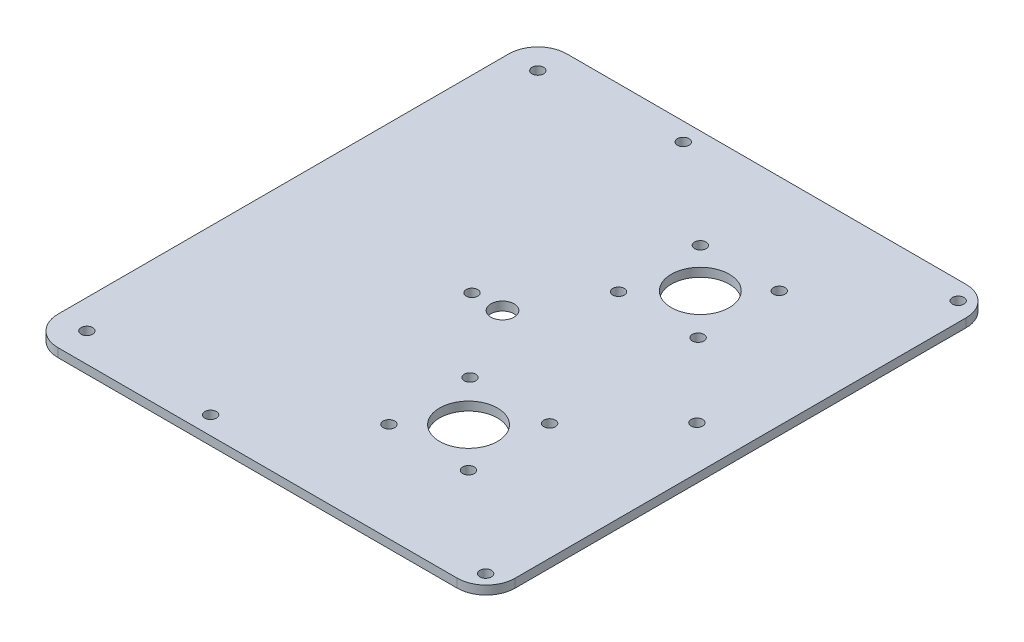
ISO-10303-21;
HEADER;
FILE_DESCRIPTION(('STEP AP214'),'2;1');
FILE_NAME('part.step','',(''),(''),'','','');
FILE_SCHEMA(('AUTOMOTIVE_DESIGN { 1 0 10303 214 1 1 1 1 }'));
ENDSEC;
DATA;
#1=APPLICATION_CONTEXT('core data for automotive mechanical design processes');
#2=APPLICATION_PROTOCOL_DEFINITION('international standard','automotive_design',2000,#1);
#3=PRODUCT_CONTEXT('',#1,'mechanical');
#4=PRODUCT('Part','Part','',(#3));
#5=PRODUCT_RELATED_PRODUCT_CATEGORY('part','',(#4));
#6=PRODUCT_DEFINITION_FORMATION('','',#4);
#7=PRODUCT_DEFINITION_CONTEXT('part definition',#1,'design');
#8=PRODUCT_DEFINITION('design','',#6,#7);
#9=PRODUCT_DEFINITION_SHAPE('','',#8);
#10=(LENGTH_UNIT() NAMED_UNIT(*) SI_UNIT(.MILLI.,.METRE.));
#11=(NAMED_UNIT(*) PLANE_ANGLE_UNIT() SI_UNIT($,.RADIAN.));
#12=(NAMED_UNIT(*) SI_UNIT($,.STERADIAN.) SOLID_ANGLE_UNIT());
#13=UNCERTAINTY_MEASURE_WITH_UNIT(LENGTH_MEASURE(1.E-05),#10,'distance_accuracy_value','');
#14=(GEOMETRIC_REPRESENTATION_CONTEXT(3) GLOBAL_UNCERTAINTY_ASSIGNED_CONTEXT((#13)) GLOBAL_UNIT_ASSIGNED_CONTEXT((#10,
#11,#12)) REPRESENTATION_CONTEXT('',''));
#15=CARTESIAN_POINT('',(0.,0.,0.));
#16=DIRECTION('',(0.,0.,1.));
#17=DIRECTION('',(1.,0.,0.));
#18=AXIS2_PLACEMENT_3D('',#15,#16,#17);
#19=CARTESIAN_POINT('',(-68.915,3.,77.83));
#20=DIRECTION('',(0.,1.,0.));
#21=DIRECTION('',(0.,0.,1.));
#22=AXIS2_PLACEMENT_3D('',#19,#20,#21);
#23=PLANE('',#22);
#24=CARTESIAN_POINT('',(38.6101586084337,3.,53.6336921319907));
#25=DIRECTION('',(0.,1.,0.));
#26=DIRECTION('',(0.,0.,1.));
#27=AXIS2_PLACEMENT_3D('',#24,#25,#26);
#28=CIRCLE('',#27,2.);
#29=CARTESIAN_POINT('',(38.6101586084337,3.,55.6336921319907));
#30=VERTEX_POINT('',#29);
#31=EDGE_CURVE('E280',#30,#30,#28,.T.);
#32=ORIENTED_EDGE('',*,*,#31,.F.);
#33=EDGE_LOOP('',(#32));
#34=FACE_BOUND('',#33,.T.);
#35=CARTESIAN_POINT('',(25.,3.,40.));
#36=DIRECTION('',(0.,1.,0.));
#37=DIRECTION('',(0.,0.,-1.));
#38=AXIS2_PLACEMENT_3D('',#35,#36,#37);
#39=CIRCLE('',#38,9.99999999999999);
#40=CARTESIAN_POINT('',(25.,3.,30.));
#41=VERTEX_POINT('',#40);
#42=EDGE_CURVE('E268',#41,#41,#39,.T.);
#43=ORIENTED_EDGE('',*,*,#42,.F.);
#44=EDGE_LOOP('',(#43));
#45=FACE_BOUND('',#44,.T.);
#46=CARTESIAN_POINT('',(11.1442287877805,3.,-25.6336921319907));
#47=DIRECTION('',(0.,1.,0.));
#48=DIRECTION('',(0.,0.,-1.));
#49=AXIS2_PLACEMENT_3D('',#46,#47,#48);
#50=CIRCLE('',#49,2.);
#51=CARTESIAN_POINT('',(11.1442287877805,3.,-27.6336921319907));
#52=VERTEX_POINT('',#51);
#53=EDGE_CURVE('E256',#52,#52,#50,.T.);
#54=ORIENTED_EDGE('',*,*,#53,.F.);
#55=EDGE_LOOP('',(#54));
#56=FACE_BOUND('',#55,.T.);
#57=CARTESIAN_POINT('',(38.6101586084337,3.,-53.6336921319907));
#58=DIRECTION('',(0.,1.,0.));
#59=DIRECTION('',(0.,0.,-1.));
#60=AXIS2_PLACEMENT_3D('',#57,#58,#59);
#61=CIRCLE('',#60,2.);
#62=CARTESIAN_POINT('',(38.6101586084337,3.,-55.6336921319907));
#63=VERTEX_POINT('',#62);
#64=EDGE_CURVE('E244',#63,#63,#61,.T.);
#65=ORIENTED_EDGE('',*,*,#64,.F.);
#66=EDGE_LOOP('',(#65));
#67=FACE_BOUND('',#66,.T.);
#68=CARTESIAN_POINT('',(-13.8262995500435,3.,2.22044604925031E-13));
#69=DIRECTION('',(0.,1.,0.));
#70=DIRECTION('',(0.,0.,-1.));
#71=AXIS2_PLACEMENT_3D('',#68,#69,#70);
#72=CIRCLE('',#71,2.00000000000001);
#73=CARTESIAN_POINT('',(-13.8262995500435,3.,-1.99999999999979));
#74=VERTEX_POINT('',#73);
#75=EDGE_CURVE('E232',#74,#74,#72,.T.);
#76=ORIENTED_EDGE('',*,*,#75,.F.);
#77=EDGE_LOOP('',(#76));
#78=FACE_BOUND('',#77,.T.);
#79=CARTESIAN_POINT('',(-22.4650000000001,3.,-81.5699999999996));
#80=DIRECTION('',(0.,1.,0.));
#81=DIRECTION('',(0.,0.,-1.));
#82=AXIS2_PLACEMENT_3D('',#79,#80,#81);
#83=CIRCLE('',#82,2.00000000000001);
#84=CARTESIAN_POINT('',(-22.4650000000001,3.,-83.5699999999996));
#85=VERTEX_POINT('',#84);
#86=EDGE_CURVE('E220',#85,#85,#83,.T.);
#87=ORIENTED_EDGE('',*,*,#86,.F.);
#88=EDGE_LOOP('',(#87));
#89=FACE_BOUND('',#88,.T.);
#90=CARTESIAN_POINT('',(72.465,3.,81.57));
#91=DIRECTION('',(0.,1.,0.));
#92=DIRECTION('',(0.,0.,-1.));
#93=AXIS2_PLACEMENT_3D('',#90,#91,#92);
#94=CIRCLE('',#93,2.);
#95=CARTESIAN_POINT('',(72.465,3.,79.57));
#96=VERTEX_POINT('',#95);
#97=EDGE_CURVE('E208',#96,#96,#94,.T.);
#98=ORIENTED_EDGE('',*,*,#97,.F.);
#99=EDGE_LOOP('',(#98));
#100=FACE_BOUND('',#99,.T.);
#101=CARTESIAN_POINT('',(72.465,3.,-81.57));
#102=DIRECTION('',(0.,1.,0.));
#103=DIRECTION('',(0.,0.,1.));
#104=AXIS2_PLACEMENT_3D('',#101,#102,#103);
#105=CIRCLE('',#104,2.);
#106=CARTESIAN_POINT('',(72.465,3.,-79.57));
#107=VERTEX_POINT('',#106);
#108=EDGE_CURVE('E196',#107,#107,#105,.T.);
#109=ORIENTED_EDGE('',*,*,#108,.F.);
#110=EDGE_LOOP('',(#109));
#111=FACE_BOUND('',#110,.T.);
#112=CARTESIAN_POINT('',(25.,3.,-40.));
#113=DIRECTION('',(0.,1.,0.));
#114=DIRECTION('',(0.,0.,1.));
#115=AXIS2_PLACEMENT_3D('',#112,#113,#114);
#116=CIRCLE('',#115,10.);
#117=CARTESIAN_POINT('',(25.,3.,-30.));
#118=VERTEX_POINT('',#117);
#119=EDGE_CURVE('E184',#118,#118,#116,.T.);
#120=ORIENTED_EDGE('',*,*,#119,.F.);
#121=EDGE_LOOP('',(#120));
#122=FACE_BOUND('',#121,.T.);
#123=CARTESIAN_POINT('',(-68.915,3.,77.83));
#124=DIRECTION('',(0.,1.,0.));
#125=DIRECTION('',(0.,0.,1.));
#126=AXIS2_PLACEMENT_3D('',#123,#124,#125);
#127=CIRCLE('',#126,9.99999999999999);
#128=CARTESIAN_POINT('',(-78.915,3.,77.83));
#129=VERTEX_POINT('',#128);
#130=CARTESIAN_POINT('',(-68.915,3.,87.83));
#131=VERTEX_POINT('',#130);
#132=EDGE_CURVE('E147',#129,#131,#127,.T.);
#133=ORIENTED_EDGE('',*,*,#132,.T.);
#134=DIRECTION('',(1.,0.,0.));
#135=VECTOR('',#134,1.);
#136=CARTESIAN_POINT('',(-68.915,3.,87.83));
#137=LINE('',#136,#135);
#138=CARTESIAN_POINT('',(68.9150000000001,3.,87.83));
#139=VERTEX_POINT('',#138);
#140=EDGE_CURVE('E95',#131,#139,#137,.T.);
#141=ORIENTED_EDGE('',*,*,#140,.T.);
#142=CARTESIAN_POINT('',(68.9150000000001,3.,77.83));
#143=DIRECTION('',(0.,1.,0.));
#144=DIRECTION('',(0.,0.,1.));
#145=AXIS2_PLACEMENT_3D('',#142,#143,#144);
#146=CIRCLE('',#145,9.99999999999999);
#147=CARTESIAN_POINT('',(78.915,3.,77.83));
#148=VERTEX_POINT('',#147);
#149=EDGE_CURVE('E162',#139,#148,#146,.T.);
#150=ORIENTED_EDGE('',*,*,#149,.T.);
#151=DIRECTION('',(0.,0.,-1.));
#152=VECTOR('',#151,1.);
#153=CARTESIAN_POINT('',(78.915,3.,-77.8299999999999));
#154=LINE('',#153,#152);
#155=CARTESIAN_POINT('',(78.915,3.,-77.8299999999999));
#156=VERTEX_POINT('',#155);
#157=EDGE_CURVE('E175',#148,#156,#154,.T.);
#158=ORIENTED_EDGE('',*,*,#157,.T.);
#159=CARTESIAN_POINT('',(68.915,3.,-77.83));
#160=DIRECTION('',(0.,1.,0.));
#161=DIRECTION('',(0.,0.,1.));
#162=AXIS2_PLACEMENT_3D('',#159,#160,#161);
#163=CIRCLE('',#162,10.);
#164=CARTESIAN_POINT('',(68.9149999999999,3.,-87.83));
#165=VERTEX_POINT('',#164);
#166=EDGE_CURVE('E114',#156,#165,#163,.T.);
#167=ORIENTED_EDGE('',*,*,#166,.T.);
#168=DIRECTION('',(-1.,0.,0.));
#169=VECTOR('',#168,1.);
#170=CARTESIAN_POINT('',(-68.9149999999999,3.,-87.83));
#171=LINE('',#170,#169);
#172=CARTESIAN_POINT('',(-68.9149999999999,3.,-87.83));
#173=VERTEX_POINT('',#172);
#174=EDGE_CURVE('E108',#165,#173,#171,.T.);
#175=ORIENTED_EDGE('',*,*,#174,.T.);
#176=CARTESIAN_POINT('',(-68.915,3.,-77.83));
#177=DIRECTION('',(0.,1.,0.));
#178=DIRECTION('',(0.,0.,1.));
#179=AXIS2_PLACEMENT_3D('',#176,#177,#178);
#180=CIRCLE('',#179,9.99999999999999);
#181=CARTESIAN_POINT('',(-78.915,3.,-77.8299999999999));
#182=VERTEX_POINT('',#181);
#183=EDGE_CURVE('E112',#173,#182,#180,.T.);
#184=ORIENTED_EDGE('',*,*,#183,.T.);
#185=DIRECTION('',(0.,0.,1.));
#186=VECTOR('',#185,1.);
#187=CARTESIAN_POINT('',(-78.915,3.,-77.8299999999999));
#188=LINE('',#187,#186);
#189=EDGE_CURVE('E52',#182,#129,#188,.T.);
#190=ORIENTED_EDGE('',*,*,#189,.T.);
#191=EDGE_LOOP('',(#133,#141,#150,#158,#167,#175,#184,#190));
#192=FACE_BOUND('',#191,.T.);
#193=CARTESIAN_POINT('',(11.3898413915664,3.,-53.6336921319907));
#194=DIRECTION('',(0.,1.,0.));
#195=DIRECTION('',(0.,0.,1.));
#196=AXIS2_PLACEMENT_3D('',#193,#194,#195);
#197=CIRCLE('',#196,2.00000000000001);
#198=CARTESIAN_POINT('',(11.3898413915664,3.,-51.6336921319907));
#199=VERTEX_POINT('',#198);
#200=EDGE_CURVE('E136',#199,#199,#197,.T.);
#201=ORIENTED_EDGE('',*,*,#200,.F.);
#202=EDGE_LOOP('',(#201));
#203=FACE_BOUND('',#202,.T.);
#204=CARTESIAN_POINT('',(63.826299550044,3.,0.));
#205=DIRECTION('',(0.,1.,0.));
#206=DIRECTION('',(0.,0.,1.));
#207=AXIS2_PLACEMENT_3D('',#204,#205,#206);
#208=CIRCLE('',#207,2.);
#209=CARTESIAN_POINT('',(63.826299550044,3.,2.));
#210=VERTEX_POINT('',#209);
#211=EDGE_CURVE('E190',#210,#210,#208,.T.);
#212=ORIENTED_EDGE('',*,*,#211,.F.);
#213=EDGE_LOOP('',(#212));
#214=FACE_BOUND('',#213,.T.);
#215=CARTESIAN_POINT('',(-68.915,3.,77.83));
#216=DIRECTION('',(0.,1.,0.));
#217=DIRECTION('',(0.,0.,-1.));
#218=AXIS2_PLACEMENT_3D('',#215,#216,#217);
#219=CIRCLE('',#218,1.99999999999998);
#220=CARTESIAN_POINT('',(-68.915,3.,75.83));
#221=VERTEX_POINT('',#220);
#222=EDGE_CURVE('E202',#221,#221,#219,.T.);
#223=ORIENTED_EDGE('',*,*,#222,.F.);
#224=EDGE_LOOP('',(#223));
#225=FACE_BOUND('',#224,.T.);
#226=CARTESIAN_POINT('',(-22.4649999999989,3.,81.5700000000002));
#227=DIRECTION('',(0.,1.,0.));
#228=DIRECTION('',(0.,0.,1.));
#229=AXIS2_PLACEMENT_3D('',#226,#227,#228);
#230=CIRCLE('',#229,2.00000000000006);
#231=CARTESIAN_POINT('',(-22.4649999999989,3.,83.5700000000003));
#232=VERTEX_POINT('',#231);
#233=EDGE_CURVE('E214',#232,#232,#230,.T.);
#234=ORIENTED_EDGE('',*,*,#233,.F.);
#235=EDGE_LOOP('',(#234));
#236=FACE_BOUND('',#235,.T.);
#237=CARTESIAN_POINT('',(-68.915,3.,-77.83));
#238=DIRECTION('',(0.,1.,0.));
#239=DIRECTION('',(0.,0.,1.));
#240=AXIS2_PLACEMENT_3D('',#237,#238,#239);
#241=CIRCLE('',#240,2.);
#242=CARTESIAN_POINT('',(-68.915,3.,-75.83));
#243=VERTEX_POINT('',#242);
#244=EDGE_CURVE('E226',#243,#243,#241,.T.);
#245=ORIENTED_EDGE('',*,*,#244,.F.);
#246=EDGE_LOOP('',(#245));
#247=FACE_BOUND('',#246,.T.);
#248=CARTESIAN_POINT('',(-3.29023143834206,3.,0.));
#249=DIRECTION('',(0.,1.,0.));
#250=DIRECTION('',(0.,0.,1.));
#251=AXIS2_PLACEMENT_3D('',#248,#249,#250);
#252=CIRCLE('',#251,4.);
#253=CARTESIAN_POINT('',(-3.29023143834206,3.,4.));
#254=VERTEX_POINT('',#253);
#255=EDGE_CURVE('E238',#254,#254,#252,.T.);
#256=ORIENTED_EDGE('',*,*,#255,.F.);
#257=EDGE_LOOP('',(#256));
#258=FACE_BOUND('',#257,.T.);
#259=CARTESIAN_POINT('',(38.6101586084337,3.,-25.6336921319907));
#260=DIRECTION('',(0.,1.,0.));
#261=DIRECTION('',(0.,0.,1.));
#262=AXIS2_PLACEMENT_3D('',#259,#260,#261);
#263=CIRCLE('',#262,2.);
#264=CARTESIAN_POINT('',(38.6101586084337,3.,-23.6336921319907));
#265=VERTEX_POINT('',#264);
#266=EDGE_CURVE('E250',#265,#265,#263,.T.);
#267=ORIENTED_EDGE('',*,*,#266,.F.);
#268=EDGE_LOOP('',(#267));
#269=FACE_BOUND('',#268,.T.);
#270=CARTESIAN_POINT('',(11.1442287877805,3.,25.6336921319907));
#271=DIRECTION('',(0.,1.,0.));
#272=DIRECTION('',(0.,0.,1.));
#273=AXIS2_PLACEMENT_3D('',#270,#271,#272);
#274=CIRCLE('',#273,2.);
#275=CARTESIAN_POINT('',(11.1442287877805,3.,27.6336921319907));
#276=VERTEX_POINT('',#275);
#277=EDGE_CURVE('E262',#276,#276,#274,.T.);
#278=ORIENTED_EDGE('',*,*,#277,.F.);
#279=EDGE_LOOP('',(#278));
#280=FACE_BOUND('',#279,.T.);
#281=CARTESIAN_POINT('',(38.6101586084337,3.,25.6336921319907));
#282=DIRECTION('',(0.,1.,0.));
#283=DIRECTION('',(0.,0.,-1.));
#284=AXIS2_PLACEMENT_3D('',#281,#282,#283);
#285=CIRCLE('',#284,2.);
#286=CARTESIAN_POINT('',(38.6101586084337,3.,23.6336921319907));
#287=VERTEX_POINT('',#286);
#288=EDGE_CURVE('E274',#287,#287,#285,.T.);
#289=ORIENTED_EDGE('',*,*,#288,.F.);
#290=EDGE_LOOP('',(#289));
#291=FACE_BOUND('',#290,.T.);
#292=CARTESIAN_POINT('',(11.1442287877805,3.,53.6336921319907));
#293=DIRECTION('',(0.,1.,0.));
#294=DIRECTION('',(0.,0.,-1.));
#295=AXIS2_PLACEMENT_3D('',#292,#293,#294);
#296=CIRCLE('',#295,2.);
#297=CARTESIAN_POINT('',(11.1442287877805,3.,51.6336921319907));
#298=VERTEX_POINT('',#297);
#299=EDGE_CURVE('E286',#298,#298,#296,.T.);
#300=ORIENTED_EDGE('',*,*,#299,.F.);
#301=EDGE_LOOP('',(#300));
#302=FACE_BOUND('',#301,.T.);
#303=ADVANCED_FACE('F35',(#34,#45,#56,#67,#78,#89,#100,#111,#122,#192,#203,#214,#225,#236,#247,
#258,#269,#280,#291,#302),#23,.T.);
#304=CARTESIAN_POINT('',(-68.915,0.,77.83));
#305=DIRECTION('',(0.,1.,0.));
#306=DIRECTION('',(0.,0.,1.));
#307=AXIS2_PLACEMENT_3D('',#304,#305,#306);
#308=PLANE('',#307);
#309=CARTESIAN_POINT('',(-68.915,0.,77.83));
#310=DIRECTION('',(0.,1.,0.));
#311=DIRECTION('',(0.,0.,1.));
#312=AXIS2_PLACEMENT_3D('',#309,#310,#311);
#313=CIRCLE('',#312,9.99999999999999);
#314=CARTESIAN_POINT('',(-78.915,0.,77.83));
#315=VERTEX_POINT('',#314);
#316=CARTESIAN_POINT('',(-68.915,0.,87.83));
#317=VERTEX_POINT('',#316);
#318=EDGE_CURVE('E132',#315,#317,#313,.T.);
#319=ORIENTED_EDGE('',*,*,#318,.F.);
#320=DIRECTION('',(0.,0.,1.));
#321=VECTOR('',#320,1.);
#322=CARTESIAN_POINT('',(-78.915,0.,-77.8299999999999));
#323=LINE('',#322,#321);
#324=CARTESIAN_POINT('',(-78.915,0.,-77.8299999999999));
#325=VERTEX_POINT('',#324);
#326=EDGE_CURVE('E87',#325,#315,#323,.T.);
#327=ORIENTED_EDGE('',*,*,#326,.F.);
#328=CARTESIAN_POINT('',(-68.915,0.,-77.83));
#329=DIRECTION('',(0.,1.,0.));
#330=DIRECTION('',(0.,0.,1.));
#331=AXIS2_PLACEMENT_3D('',#328,#329,#330);
#332=CIRCLE('',#331,9.99999999999999);
#333=CARTESIAN_POINT('',(-68.9149999999999,0.,-87.83));
#334=VERTEX_POINT('',#333);
#335=EDGE_CURVE('E81',#334,#325,#332,.T.);
#336=ORIENTED_EDGE('',*,*,#335,.F.);
#337=DIRECTION('',(-1.,0.,0.));
#338=VECTOR('',#337,1.);
#339=CARTESIAN_POINT('',(-68.9149999999999,0.,-87.83));
#340=LINE('',#339,#338);
#341=CARTESIAN_POINT('',(68.9149999999999,0.,-87.83));
#342=VERTEX_POINT('',#341);
#343=EDGE_CURVE('E122',#342,#334,#340,.T.);
#344=ORIENTED_EDGE('',*,*,#343,.F.);
#345=CARTESIAN_POINT('',(68.915,0.,-77.83));
#346=DIRECTION('',(0.,1.,0.));
#347=DIRECTION('',(0.,0.,1.));
#348=AXIS2_PLACEMENT_3D('',#345,#346,#347);
#349=CIRCLE('',#348,10.);
#350=CARTESIAN_POINT('',(78.915,0.,-77.8299999999999));
#351=VERTEX_POINT('',#350);
#352=EDGE_CURVE('E142',#351,#342,#349,.T.);
#353=ORIENTED_EDGE('',*,*,#352,.F.);
#354=DIRECTION('',(0.,0.,-1.));
#355=VECTOR('',#354,1.);
#356=CARTESIAN_POINT('',(78.915,0.,-77.8299999999999));
#357=LINE('',#356,#355);
#358=CARTESIAN_POINT('',(78.915,0.,77.83));
#359=VERTEX_POINT('',#358);
#360=EDGE_CURVE('E140',#359,#351,#357,.T.);
#361=ORIENTED_EDGE('',*,*,#360,.F.);
#362=CARTESIAN_POINT('',(68.9150000000001,0.,77.83));
#363=DIRECTION('',(0.,1.,0.));
#364=DIRECTION('',(0.,0.,1.));
#365=AXIS2_PLACEMENT_3D('',#362,#363,#364);
#366=CIRCLE('',#365,9.99999999999999);
#367=CARTESIAN_POINT('',(68.9150000000001,0.,87.83));
#368=VERTEX_POINT('',#367);
#369=EDGE_CURVE('E138',#368,#359,#366,.T.);
#370=ORIENTED_EDGE('',*,*,#369,.F.);
#371=DIRECTION('',(1.,0.,0.));
#372=VECTOR('',#371,1.);
#373=CARTESIAN_POINT('',(-68.915,0.,87.83));
#374=LINE('',#373,#372);
#375=EDGE_CURVE('E135',#317,#368,#374,.T.);
#376=ORIENTED_EDGE('',*,*,#375,.F.);
#377=EDGE_LOOP('',(#319,#327,#336,#344,#353,#361,#370,#376));
#378=FACE_BOUND('',#377,.T.);
#379=CARTESIAN_POINT('',(11.3898413915664,0.,-53.6336921319907));
#380=DIRECTION('',(0.,1.,0.));
#381=DIRECTION('',(0.,0.,1.));
#382=AXIS2_PLACEMENT_3D('',#379,#380,#381);
#383=CIRCLE('',#382,2.00000000000001);
#384=CARTESIAN_POINT('',(11.3898413915664,0.,-51.6336921319907));
#385=VERTEX_POINT('',#384);
#386=EDGE_CURVE('E181',#385,#385,#383,.T.);
#387=ORIENTED_EDGE('',*,*,#386,.T.);
#388=EDGE_LOOP('',(#387));
#389=FACE_BOUND('',#388,.T.);
#390=CARTESIAN_POINT('',(25.,0.,-40.));
#391=DIRECTION('',(0.,1.,0.));
#392=DIRECTION('',(0.,0.,1.));
#393=AXIS2_PLACEMENT_3D('',#390,#391,#392);
#394=CIRCLE('',#393,10.);
#395=CARTESIAN_POINT('',(25.,0.,-30.));
#396=VERTEX_POINT('',#395);
#397=EDGE_CURVE('E187',#396,#396,#394,.T.);
#398=ORIENTED_EDGE('',*,*,#397,.T.);
#399=EDGE_LOOP('',(#398));
#400=FACE_BOUND('',#399,.T.);
#401=CARTESIAN_POINT('',(63.826299550044,0.,0.));
#402=DIRECTION('',(0.,1.,0.));
#403=DIRECTION('',(0.,0.,1.));
#404=AXIS2_PLACEMENT_3D('',#401,#402,#403);
#405=CIRCLE('',#404,2.);
#406=CARTESIAN_POINT('',(63.826299550044,0.,2.));
#407=VERTEX_POINT('',#406);
#408=EDGE_CURVE('E193',#407,#407,#405,.T.);
#409=ORIENTED_EDGE('',*,*,#408,.T.);
#410=EDGE_LOOP('',(#409));
#411=FACE_BOUND('',#410,.T.);
#412=CARTESIAN_POINT('',(72.465,0.,-81.57));
#413=DIRECTION('',(0.,1.,0.));
#414=DIRECTION('',(0.,0.,1.));
#415=AXIS2_PLACEMENT_3D('',#412,#413,#414);
#416=CIRCLE('',#415,2.);
#417=CARTESIAN_POINT('',(72.465,0.,-79.57));
#418=VERTEX_POINT('',#417);
#419=EDGE_CURVE('E199',#418,#418,#416,.T.);
#420=ORIENTED_EDGE('',*,*,#419,.T.);
#421=EDGE_LOOP('',(#420));
#422=FACE_BOUND('',#421,.T.);
#423=CARTESIAN_POINT('',(-68.915,0.,77.83));
#424=DIRECTION('',(0.,1.,0.));
#425=DIRECTION('',(0.,0.,-1.));
#426=AXIS2_PLACEMENT_3D('',#423,#424,#425);
#427=CIRCLE('',#426,1.99999999999998);
#428=CARTESIAN_POINT('',(-68.915,0.,75.83));
#429=VERTEX_POINT('',#428);
#430=EDGE_CURVE('E205',#429,#429,#427,.T.);
#431=ORIENTED_EDGE('',*,*,#430,.T.);
#432=EDGE_LOOP('',(#431));
#433=FACE_BOUND('',#432,.T.);
#434=CARTESIAN_POINT('',(72.465,0.,81.57));
#435=DIRECTION('',(0.,1.,0.));
#436=DIRECTION('',(0.,0.,-1.));
#437=AXIS2_PLACEMENT_3D('',#434,#435,#436);
#438=CIRCLE('',#437,2.);
#439=CARTESIAN_POINT('',(72.465,0.,79.57));
#440=VERTEX_POINT('',#439);
#441=EDGE_CURVE('E211',#440,#440,#438,.T.);
#442=ORIENTED_EDGE('',*,*,#441,.T.);
#443=EDGE_LOOP('',(#442));
#444=FACE_BOUND('',#443,.T.);
#445=CARTESIAN_POINT('',(-22.4649999999989,0.,81.5700000000002));
#446=DIRECTION('',(0.,1.,0.));
#447=DIRECTION('',(0.,0.,1.));
#448=AXIS2_PLACEMENT_3D('',#445,#446,#447);
#449=CIRCLE('',#448,2.00000000000006);
#450=CARTESIAN_POINT('',(-22.4649999999989,0.,83.5700000000003));
#451=VERTEX_POINT('',#450);
#452=EDGE_CURVE('E217',#451,#451,#449,.T.);
#453=ORIENTED_EDGE('',*,*,#452,.T.);
#454=EDGE_LOOP('',(#453));
#455=FACE_BOUND('',#454,.T.);
#456=CARTESIAN_POINT('',(-22.4650000000001,0.,-81.5699999999996));
#457=DIRECTION('',(0.,1.,0.));
#458=DIRECTION('',(0.,0.,-1.));
#459=AXIS2_PLACEMENT_3D('',#456,#457,#458);
#460=CIRCLE('',#459,2.00000000000001);
#461=CARTESIAN_POINT('',(-22.4650000000001,0.,-83.5699999999996));
#462=VERTEX_POINT('',#461);
#463=EDGE_CURVE('E223',#462,#462,#460,.T.);
#464=ORIENTED_EDGE('',*,*,#463,.T.);
#465=EDGE_LOOP('',(#464));
#466=FACE_BOUND('',#465,.T.);
#467=CARTESIAN_POINT('',(-68.915,0.,-77.83));
#468=DIRECTION('',(0.,1.,0.));
#469=DIRECTION('',(0.,0.,1.));
#470=AXIS2_PLACEMENT_3D('',#467,#468,#469);
#471=CIRCLE('',#470,2.);
#472=CARTESIAN_POINT('',(-68.915,0.,-75.83));
#473=VERTEX_POINT('',#472);
#474=EDGE_CURVE('E229',#473,#473,#471,.T.);
#475=ORIENTED_EDGE('',*,*,#474,.T.);
#476=EDGE_LOOP('',(#475));
#477=FACE_BOUND('',#476,.T.);
#478=CARTESIAN_POINT('',(-13.8262995500435,0.,2.22044604925031E-13));
#479=DIRECTION('',(0.,1.,0.));
#480=DIRECTION('',(0.,0.,-1.));
#481=AXIS2_PLACEMENT_3D('',#478,#479,#480);
#482=CIRCLE('',#481,2.00000000000001);
#483=CARTESIAN_POINT('',(-13.8262995500435,0.,-1.99999999999979));
#484=VERTEX_POINT('',#483);
#485=EDGE_CURVE('E235',#484,#484,#482,.T.);
#486=ORIENTED_EDGE('',*,*,#485,.T.);
#487=EDGE_LOOP('',(#486));
#488=FACE_BOUND('',#487,.T.);
#489=CARTESIAN_POINT('',(-3.29023143834206,0.,0.));
#490=DIRECTION('',(0.,1.,0.));
#491=DIRECTION('',(0.,0.,1.));
#492=AXIS2_PLACEMENT_3D('',#489,#490,#491);
#493=CIRCLE('',#492,4.);
#494=CARTESIAN_POINT('',(-3.29023143834206,0.,4.));
#495=VERTEX_POINT('',#494);
#496=EDGE_CURVE('E241',#495,#495,#493,.T.);
#497=ORIENTED_EDGE('',*,*,#496,.T.);
#498=EDGE_LOOP('',(#497));
#499=FACE_BOUND('',#498,.T.);
#500=CARTESIAN_POINT('',(38.6101586084337,0.,-53.6336921319907));
#501=DIRECTION('',(0.,1.,0.));
#502=DIRECTION('',(0.,0.,-1.));
#503=AXIS2_PLACEMENT_3D('',#500,#501,#502);
#504=CIRCLE('',#503,2.);
#505=CARTESIAN_POINT('',(38.6101586084337,0.,-55.6336921319907));
#506=VERTEX_POINT('',#505);
#507=EDGE_CURVE('E247',#506,#506,#504,.T.);
#508=ORIENTED_EDGE('',*,*,#507,.T.);
#509=EDGE_LOOP('',(#508));
#510=FACE_BOUND('',#509,.T.);
#511=CARTESIAN_POINT('',(38.6101586084337,0.,-25.6336921319907));
#512=DIRECTION('',(0.,1.,0.));
#513=DIRECTION('',(0.,0.,1.));
#514=AXIS2_PLACEMENT_3D('',#511,#512,#513);
#515=CIRCLE('',#514,2.);
#516=CARTESIAN_POINT('',(38.6101586084337,0.,-23.6336921319907));
#517=VERTEX_POINT('',#516);
#518=EDGE_CURVE('E253',#517,#517,#515,.T.);
#519=ORIENTED_EDGE('',*,*,#518,.T.);
#520=EDGE_LOOP('',(#519));
#521=FACE_BOUND('',#520,.T.);
#522=CARTESIAN_POINT('',(11.1442287877805,0.,-25.6336921319907));
#523=DIRECTION('',(0.,1.,0.));
#524=DIRECTION('',(0.,0.,-1.));
#525=AXIS2_PLACEMENT_3D('',#522,#523,#524);
#526=CIRCLE('',#525,2.);
#527=CARTESIAN_POINT('',(11.1442287877805,0.,-27.6336921319907));
#528=VERTEX_POINT('',#527);
#529=EDGE_CURVE('E259',#528,#528,#526,.T.);
#530=ORIENTED_EDGE('',*,*,#529,.T.);
#531=EDGE_LOOP('',(#530));
#532=FACE_BOUND('',#531,.T.);
#533=CARTESIAN_POINT('',(11.1442287877805,0.,25.6336921319907));
#534=DIRECTION('',(0.,1.,0.));
#535=DIRECTION('',(0.,0.,1.));
#536=AXIS2_PLACEMENT_3D('',#533,#534,#535);
#537=CIRCLE('',#536,2.);
#538=CARTESIAN_POINT('',(11.1442287877805,0.,27.6336921319907));
#539=VERTEX_POINT('',#538);
#540=EDGE_CURVE('E265',#539,#539,#537,.T.);
#541=ORIENTED_EDGE('',*,*,#540,.T.);
#542=EDGE_LOOP('',(#541));
#543=FACE_BOUND('',#542,.T.);
#544=CARTESIAN_POINT('',(25.,0.,40.));
#545=DIRECTION('',(0.,1.,0.));
#546=DIRECTION('',(0.,0.,-1.));
#547=AXIS2_PLACEMENT_3D('',#544,#545,#546);
#548=CIRCLE('',#547,9.99999999999999);
#549=CARTESIAN_POINT('',(25.,0.,30.));
#550=VERTEX_POINT('',#549);
#551=EDGE_CURVE('E271',#550,#550,#548,.T.);
#552=ORIENTED_EDGE('',*,*,#551,.T.);
#553=EDGE_LOOP('',(#552));
#554=FACE_BOUND('',#553,.T.);
#555=CARTESIAN_POINT('',(38.6101586084337,0.,25.6336921319907));
#556=DIRECTION('',(0.,1.,0.));
#557=DIRECTION('',(0.,0.,-1.));
#558=AXIS2_PLACEMENT_3D('',#555,#556,#557);
#559=CIRCLE('',#558,2.);
#560=CARTESIAN_POINT('',(38.6101586084337,0.,23.6336921319907));
#561=VERTEX_POINT('',#560);
#562=EDGE_CURVE('E277',#561,#561,#559,.T.);
#563=ORIENTED_EDGE('',*,*,#562,.T.);
#564=EDGE_LOOP('',(#563));
#565=FACE_BOUND('',#564,.T.);
#566=CARTESIAN_POINT('',(38.6101586084337,0.,53.6336921319907));
#567=DIRECTION('',(0.,1.,0.));
#568=DIRECTION('',(0.,0.,1.));
#569=AXIS2_PLACEMENT_3D('',#566,#567,#568);
#570=CIRCLE('',#569,2.);
#571=CARTESIAN_POINT('',(38.6101586084337,0.,55.6336921319907));
#572=VERTEX_POINT('',#571);
#573=EDGE_CURVE('E283',#572,#572,#570,.T.);
#574=ORIENTED_EDGE('',*,*,#573,.T.);
#575=EDGE_LOOP('',(#574));
#576=FACE_BOUND('',#575,.T.);
#577=CARTESIAN_POINT('',(11.1442287877805,0.,53.6336921319907));
#578=DIRECTION('',(0.,1.,0.));
#579=DIRECTION('',(0.,0.,-1.));
#580=AXIS2_PLACEMENT_3D('',#577,#578,#579);
#581=CIRCLE('',#580,2.);
#582=CARTESIAN_POINT('',(11.1442287877805,0.,51.6336921319907));
#583=VERTEX_POINT('',#582);
#584=EDGE_CURVE('E289',#583,#583,#581,.T.);
#585=ORIENTED_EDGE('',*,*,#584,.T.);
#586=EDGE_LOOP('',(#585));
#587=FACE_BOUND('',#586,.T.);
#588=ADVANCED_FACE('F166',(#378,#389,#400,#411,#422,#433,#444,#455,#466,#477,#488,#499,#510,
#521,#532,#543,#554,#565,#576,#587),#308,.F.);
#589=CARTESIAN_POINT('',(-68.915,3.,77.83));
#590=DIRECTION('',(0.,-1.,0.));
#591=DIRECTION('',(0.,0.,-1.));
#592=AXIS2_PLACEMENT_3D('',#589,#590,#591);
#593=CYLINDRICAL_SURFACE('',#592,9.99999999999999);
#594=ORIENTED_EDGE('',*,*,#318,.T.);
#595=DIRECTION('',(0.,-1.,0.));
#596=VECTOR('',#595,1.);
#597=CARTESIAN_POINT('',(-68.915,3.,87.83));
#598=LINE('',#597,#596);
#599=EDGE_CURVE('E11',#131,#317,#598,.T.);
#600=ORIENTED_EDGE('',*,*,#599,.F.);
#601=ORIENTED_EDGE('',*,*,#132,.F.);
#602=DIRECTION('',(0.,-1.,0.));
#603=VECTOR('',#602,1.);
#604=CARTESIAN_POINT('',(-78.915,3.,77.83));
#605=LINE('',#604,#603);
#606=EDGE_CURVE('E128',#129,#315,#605,.T.);
#607=ORIENTED_EDGE('',*,*,#606,.T.);
#608=EDGE_LOOP('',(#594,#600,#601,#607));
#609=FACE_BOUND('',#608,.T.);
#610=ADVANCED_FACE('F37',(#609),#593,.T.);
#611=CARTESIAN_POINT('',(-68.915,3.,87.83));
#612=DIRECTION('',(0.,0.,-1.));
#613=DIRECTION('',(-1.,0.,0.));
#614=AXIS2_PLACEMENT_3D('',#611,#612,#613);
#615=PLANE('',#614);
#616=ORIENTED_EDGE('',*,*,#375,.T.);
#617=DIRECTION('',(0.,-1.,0.));
#618=VECTOR('',#617,1.);
#619=CARTESIAN_POINT('',(68.9150000000001,3.,87.83));
#620=LINE('',#619,#618);
#621=EDGE_CURVE('E44',#139,#368,#620,.T.);
#622=ORIENTED_EDGE('',*,*,#621,.F.);
#623=ORIENTED_EDGE('',*,*,#140,.F.);
#624=ORIENTED_EDGE('',*,*,#599,.T.);
#625=EDGE_LOOP('',(#616,#622,#623,#624));
#626=FACE_BOUND('',#625,.T.);
#627=ADVANCED_FACE('F323',(#626),#615,.F.);
#628=CARTESIAN_POINT('',(68.9150000000001,3.,77.83));
#629=DIRECTION('',(0.,-1.,0.));
#630=DIRECTION('',(0.,0.,-1.));
#631=AXIS2_PLACEMENT_3D('',#628,#629,#630);
#632=CYLINDRICAL_SURFACE('',#631,9.99999999999999);
#633=ORIENTED_EDGE('',*,*,#369,.T.);
#634=DIRECTION('',(0.,-1.,0.));
#635=VECTOR('',#634,1.);
#636=CARTESIAN_POINT('',(78.915,3.,77.83));
#637=LINE('',#636,#635);
#638=EDGE_CURVE('E154',#148,#359,#637,.T.);
#639=ORIENTED_EDGE('',*,*,#638,.F.);
#640=ORIENTED_EDGE('',*,*,#149,.F.);
#641=ORIENTED_EDGE('',*,*,#621,.T.);
#642=EDGE_LOOP('',(#633,#639,#640,#641));
#643=FACE_BOUND('',#642,.T.);
#644=ADVANCED_FACE('F160',(#643),#632,.T.);
#645=CARTESIAN_POINT('',(78.915,3.,-77.8299999999999));
#646=DIRECTION('',(-1.,0.,0.));
#647=DIRECTION('',(0.,0.,1.));
#648=AXIS2_PLACEMENT_3D('',#645,#646,#647);
#649=PLANE('',#648);
#650=ORIENTED_EDGE('',*,*,#360,.T.);
#651=DIRECTION('',(0.,-1.,0.));
#652=VECTOR('',#651,1.);
#653=CARTESIAN_POINT('',(78.915,3.,-77.8299999999999));
#654=LINE('',#653,#652);
#655=EDGE_CURVE('E151',#156,#351,#654,.T.);
#656=ORIENTED_EDGE('',*,*,#655,.F.);
#657=ORIENTED_EDGE('',*,*,#157,.F.);
#658=ORIENTED_EDGE('',*,*,#638,.T.);
#659=EDGE_LOOP('',(#650,#656,#657,#658));
#660=FACE_BOUND('',#659,.T.);
#661=ADVANCED_FACE('F171',(#660),#649,.F.);
#662=CARTESIAN_POINT('',(68.915,3.,-77.83));
#663=DIRECTION('',(0.,-1.,0.));
#664=DIRECTION('',(0.,0.,-1.));
#665=AXIS2_PLACEMENT_3D('',#662,#663,#664);
#666=CYLINDRICAL_SURFACE('',#665,10.);
#667=ORIENTED_EDGE('',*,*,#352,.T.);
#668=DIRECTION('',(0.,-1.,0.));
#669=VECTOR('',#668,1.);
#670=CARTESIAN_POINT('',(68.9149999999999,3.,-87.83));
#671=LINE('',#670,#669);
#672=EDGE_CURVE('E123',#165,#342,#671,.T.);
#673=ORIENTED_EDGE('',*,*,#672,.F.);
#674=ORIENTED_EDGE('',*,*,#166,.F.);
#675=ORIENTED_EDGE('',*,*,#655,.T.);
#676=EDGE_LOOP('',(#667,#673,#674,#675));
#677=FACE_BOUND('',#676,.T.);
#678=ADVANCED_FACE('F174',(#677),#666,.T.);
#679=CARTESIAN_POINT('',(-68.9149999999999,3.,-87.83));
#680=DIRECTION('',(0.,0.,1.));
#681=DIRECTION('',(1.,0.,0.));
#682=AXIS2_PLACEMENT_3D('',#679,#680,#681);
#683=PLANE('',#682);
#684=ORIENTED_EDGE('',*,*,#343,.T.);
#685=DIRECTION('',(0.,-1.,0.));
#686=VECTOR('',#685,1.);
#687=CARTESIAN_POINT('',(-68.9149999999999,3.,-87.83));
#688=LINE('',#687,#686);
#689=EDGE_CURVE('E119',#173,#334,#688,.T.);
#690=ORIENTED_EDGE('',*,*,#689,.F.);
#691=ORIENTED_EDGE('',*,*,#174,.F.);
#692=ORIENTED_EDGE('',*,*,#672,.T.);
#693=EDGE_LOOP('',(#684,#690,#691,#692));
#694=FACE_BOUND('',#693,.T.);
#695=ADVANCED_FACE('F120',(#694),#683,.F.);
#696=CARTESIAN_POINT('',(-68.915,3.,-77.83));
#697=DIRECTION('',(0.,-1.,0.));
#698=DIRECTION('',(0.,0.,-1.));
#699=AXIS2_PLACEMENT_3D('',#696,#697,#698);
#700=CYLINDRICAL_SURFACE('',#699,9.99999999999999);
#701=ORIENTED_EDGE('',*,*,#335,.T.);
#702=DIRECTION('',(0.,-1.,0.));
#703=VECTOR('',#702,1.);
#704=CARTESIAN_POINT('',(-78.915,3.,-77.8299999999999));
#705=LINE('',#704,#703);
#706=EDGE_CURVE('E124',#182,#325,#705,.T.);
#707=ORIENTED_EDGE('',*,*,#706,.F.);
#708=ORIENTED_EDGE('',*,*,#183,.F.);
#709=ORIENTED_EDGE('',*,*,#689,.T.);
#710=EDGE_LOOP('',(#701,#707,#708,#709));
#711=FACE_BOUND('',#710,.T.);
#712=ADVANCED_FACE('F126',(#711),#700,.T.);
#713=CARTESIAN_POINT('',(-78.915,3.,-77.8299999999999));
#714=DIRECTION('',(1.,0.,0.));
#715=DIRECTION('',(0.,0.,-1.));
#716=AXIS2_PLACEMENT_3D('',#713,#714,#715);
#717=PLANE('',#716);
#718=ORIENTED_EDGE('',*,*,#326,.T.);
#719=ORIENTED_EDGE('',*,*,#606,.F.);
#720=ORIENTED_EDGE('',*,*,#189,.F.);
#721=ORIENTED_EDGE('',*,*,#706,.T.);
#722=EDGE_LOOP('',(#718,#719,#720,#721));
#723=FACE_BOUND('',#722,.T.);
#724=ADVANCED_FACE('F311',(#723),#717,.F.);
#725=CARTESIAN_POINT('',(11.3898413915664,3.,-53.6336921319907));
#726=DIRECTION('',(0.,-1.,0.));
#727=DIRECTION('',(0.,0.,-1.));
#728=AXIS2_PLACEMENT_3D('',#725,#726,#727);
#729=CYLINDRICAL_SURFACE('',#728,2.00000000000001);
#730=ORIENTED_EDGE('',*,*,#200,.T.);
#731=EDGE_LOOP('',(#730));
#732=FACE_BOUND('',#731,.T.);
#733=ORIENTED_EDGE('',*,*,#386,.F.);
#734=EDGE_LOOP('',(#733));
#735=FACE_BOUND('',#734,.T.);
#736=ADVANCED_FACE('F308',(#732,#735),#729,.F.);
#737=CARTESIAN_POINT('',(25.,3.,-40.));
#738=DIRECTION('',(0.,-1.,0.));
#739=DIRECTION('',(0.,0.,-1.));
#740=AXIS2_PLACEMENT_3D('',#737,#738,#739);
#741=CYLINDRICAL_SURFACE('',#740,10.);
#742=ORIENTED_EDGE('',*,*,#119,.T.);
#743=EDGE_LOOP('',(#742));
#744=FACE_BOUND('',#743,.T.);
#745=ORIENTED_EDGE('',*,*,#397,.F.);
#746=EDGE_LOOP('',(#745));
#747=FACE_BOUND('',#746,.T.);
#748=ADVANCED_FACE('F387',(#744,#747),#741,.F.);
#749=CARTESIAN_POINT('',(63.826299550044,3.,0.));
#750=DIRECTION('',(0.,-1.,0.));
#751=DIRECTION('',(0.,0.,-1.));
#752=AXIS2_PLACEMENT_3D('',#749,#750,#751);
#753=CYLINDRICAL_SURFACE('',#752,2.);
#754=ORIENTED_EDGE('',*,*,#211,.T.);
#755=EDGE_LOOP('',(#754));
#756=FACE_BOUND('',#755,.T.);
#757=ORIENTED_EDGE('',*,*,#408,.F.);
#758=EDGE_LOOP('',(#757));
#759=FACE_BOUND('',#758,.T.);
#760=ADVANCED_FACE('F395',(#756,#759),#753,.F.);
#761=CARTESIAN_POINT('',(72.465,3.,-81.57));
#762=DIRECTION('',(0.,-1.,0.));
#763=DIRECTION('',(0.,0.,-1.));
#764=AXIS2_PLACEMENT_3D('',#761,#762,#763);
#765=CYLINDRICAL_SURFACE('',#764,2.);
#766=ORIENTED_EDGE('',*,*,#108,.T.);
#767=EDGE_LOOP('',(#766));
#768=FACE_BOUND('',#767,.T.);
#769=ORIENTED_EDGE('',*,*,#419,.F.);
#770=EDGE_LOOP('',(#769));
#771=FACE_BOUND('',#770,.T.);
#772=ADVANCED_FACE('F403',(#768,#771),#765,.F.);
#773=CARTESIAN_POINT('',(-68.915,3.,77.83));
#774=DIRECTION('',(0.,-1.,0.));
#775=DIRECTION('',(0.,0.,-1.));
#776=AXIS2_PLACEMENT_3D('',#773,#774,#775);
#777=CYLINDRICAL_SURFACE('',#776,1.99999999999998);
#778=ORIENTED_EDGE('',*,*,#222,.T.);
#779=EDGE_LOOP('',(#778));
#780=FACE_BOUND('',#779,.T.);
#781=ORIENTED_EDGE('',*,*,#430,.F.);
#782=EDGE_LOOP('',(#781));
#783=FACE_BOUND('',#782,.T.);
#784=ADVANCED_FACE('F412',(#780,#783),#777,.F.);
#785=CARTESIAN_POINT('',(72.465,3.,81.57));
#786=DIRECTION('',(0.,-1.,0.));
#787=DIRECTION('',(0.,0.,-1.));
#788=AXIS2_PLACEMENT_3D('',#785,#786,#787);
#789=CYLINDRICAL_SURFACE('',#788,2.);
#790=ORIENTED_EDGE('',*,*,#97,.T.);
#791=EDGE_LOOP('',(#790));
#792=FACE_BOUND('',#791,.T.);
#793=ORIENTED_EDGE('',*,*,#441,.F.);
#794=EDGE_LOOP('',(#793));
#795=FACE_BOUND('',#794,.T.);
#796=ADVANCED_FACE('F421',(#792,#795),#789,.F.);
#797=CARTESIAN_POINT('',(-22.4649999999989,3.,81.5700000000002));
#798=DIRECTION('',(0.,-1.,0.));
#799=DIRECTION('',(0.,0.,-1.));
#800=AXIS2_PLACEMENT_3D('',#797,#798,#799);
#801=CYLINDRICAL_SURFACE('',#800,2.00000000000006);
#802=ORIENTED_EDGE('',*,*,#233,.T.);
#803=EDGE_LOOP('',(#802));
#804=FACE_BOUND('',#803,.T.);
#805=ORIENTED_EDGE('',*,*,#452,.F.);
#806=EDGE_LOOP('',(#805));
#807=FACE_BOUND('',#806,.T.);
#808=ADVANCED_FACE('F430',(#804,#807),#801,.F.);
#809=CARTESIAN_POINT('',(-22.4650000000001,3.,-81.5699999999996));
#810=DIRECTION('',(0.,-1.,0.));
#811=DIRECTION('',(0.,0.,-1.));
#812=AXIS2_PLACEMENT_3D('',#809,#810,#811);
#813=CYLINDRICAL_SURFACE('',#812,2.00000000000001);
#814=ORIENTED_EDGE('',*,*,#86,.T.);
#815=EDGE_LOOP('',(#814));
#816=FACE_BOUND('',#815,.T.);
#817=ORIENTED_EDGE('',*,*,#463,.F.);
#818=EDGE_LOOP('',(#817));
#819=FACE_BOUND('',#818,.T.);
#820=ADVANCED_FACE('F439',(#816,#819),#813,.F.);
#821=CARTESIAN_POINT('',(-68.915,3.,-77.83));
#822=DIRECTION('',(0.,-1.,0.));
#823=DIRECTION('',(0.,0.,-1.));
#824=AXIS2_PLACEMENT_3D('',#821,#822,#823);
#825=CYLINDRICAL_SURFACE('',#824,2.);
#826=ORIENTED_EDGE('',*,*,#244,.T.);
#827=EDGE_LOOP('',(#826));
#828=FACE_BOUND('',#827,.T.);
#829=ORIENTED_EDGE('',*,*,#474,.F.);
#830=EDGE_LOOP('',(#829));
#831=FACE_BOUND('',#830,.T.);
#832=ADVANCED_FACE('F448',(#828,#831),#825,.F.);
#833=CARTESIAN_POINT('',(-13.8262995500435,3.,2.22044604925031E-13));
#834=DIRECTION('',(0.,-1.,0.));
#835=DIRECTION('',(0.,0.,-1.));
#836=AXIS2_PLACEMENT_3D('',#833,#834,#835);
#837=CYLINDRICAL_SURFACE('',#836,2.00000000000001);
#838=ORIENTED_EDGE('',*,*,#75,.T.);
#839=EDGE_LOOP('',(#838));
#840=FACE_BOUND('',#839,.T.);
#841=ORIENTED_EDGE('',*,*,#485,.F.);
#842=EDGE_LOOP('',(#841));
#843=FACE_BOUND('',#842,.T.);
#844=ADVANCED_FACE('F457',(#840,#843),#837,.F.);
#845=CARTESIAN_POINT('',(-3.29023143834206,3.,0.));
#846=DIRECTION('',(0.,-1.,0.));
#847=DIRECTION('',(0.,0.,-1.));
#848=AXIS2_PLACEMENT_3D('',#845,#846,#847);
#849=CYLINDRICAL_SURFACE('',#848,4.);
#850=ORIENTED_EDGE('',*,*,#255,.T.);
#851=EDGE_LOOP('',(#850));
#852=FACE_BOUND('',#851,.T.);
#853=ORIENTED_EDGE('',*,*,#496,.F.);
#854=EDGE_LOOP('',(#853));
#855=FACE_BOUND('',#854,.T.);
#856=ADVANCED_FACE('F466',(#852,#855),#849,.F.);
#857=CARTESIAN_POINT('',(38.6101586084337,3.,-53.6336921319907));
#858=DIRECTION('',(0.,-1.,0.));
#859=DIRECTION('',(0.,0.,-1.));
#860=AXIS2_PLACEMENT_3D('',#857,#858,#859);
#861=CYLINDRICAL_SURFACE('',#860,2.);
#862=ORIENTED_EDGE('',*,*,#64,.T.);
#863=EDGE_LOOP('',(#862));
#864=FACE_BOUND('',#863,.T.);
#865=ORIENTED_EDGE('',*,*,#507,.F.);
#866=EDGE_LOOP('',(#865));
#867=FACE_BOUND('',#866,.T.);
#868=ADVANCED_FACE('F475',(#864,#867),#861,.F.);
#869=CARTESIAN_POINT('',(38.6101586084337,3.,-25.6336921319907));
#870=DIRECTION('',(0.,-1.,0.));
#871=DIRECTION('',(0.,0.,-1.));
#872=AXIS2_PLACEMENT_3D('',#869,#870,#871);
#873=CYLINDRICAL_SURFACE('',#872,2.);
#874=ORIENTED_EDGE('',*,*,#266,.T.);
#875=EDGE_LOOP('',(#874));
#876=FACE_BOUND('',#875,.T.);
#877=ORIENTED_EDGE('',*,*,#518,.F.);
#878=EDGE_LOOP('',(#877));
#879=FACE_BOUND('',#878,.T.);
#880=ADVANCED_FACE('F484',(#876,#879),#873,.F.);
#881=CARTESIAN_POINT('',(11.1442287877805,3.,-25.6336921319907));
#882=DIRECTION('',(0.,-1.,0.));
#883=DIRECTION('',(0.,0.,-1.));
#884=AXIS2_PLACEMENT_3D('',#881,#882,#883);
#885=CYLINDRICAL_SURFACE('',#884,2.);
#886=ORIENTED_EDGE('',*,*,#53,.T.);
#887=EDGE_LOOP('',(#886));
#888=FACE_BOUND('',#887,.T.);
#889=ORIENTED_EDGE('',*,*,#529,.F.);
#890=EDGE_LOOP('',(#889));
#891=FACE_BOUND('',#890,.T.);
#892=ADVANCED_FACE('F493',(#888,#891),#885,.F.);
#893=CARTESIAN_POINT('',(11.1442287877805,3.,25.6336921319907));
#894=DIRECTION('',(0.,-1.,0.));
#895=DIRECTION('',(0.,0.,-1.));
#896=AXIS2_PLACEMENT_3D('',#893,#894,#895);
#897=CYLINDRICAL_SURFACE('',#896,2.);
#898=ORIENTED_EDGE('',*,*,#277,.T.);
#899=EDGE_LOOP('',(#898));
#900=FACE_BOUND('',#899,.T.);
#901=ORIENTED_EDGE('',*,*,#540,.F.);
#902=EDGE_LOOP('',(#901));
#903=FACE_BOUND('',#902,.T.);
#904=ADVANCED_FACE('F502',(#900,#903),#897,.F.);
#905=CARTESIAN_POINT('',(25.,3.,40.));
#906=DIRECTION('',(0.,-1.,0.));
#907=DIRECTION('',(0.,0.,-1.));
#908=AXIS2_PLACEMENT_3D('',#905,#906,#907);
#909=CYLINDRICAL_SURFACE('',#908,9.99999999999999);
#910=ORIENTED_EDGE('',*,*,#42,.T.);
#911=EDGE_LOOP('',(#910));
#912=FACE_BOUND('',#911,.T.);
#913=ORIENTED_EDGE('',*,*,#551,.F.);
#914=EDGE_LOOP('',(#913));
#915=FACE_BOUND('',#914,.T.);
#916=ADVANCED_FACE('F511',(#912,#915),#909,.F.);
#917=CARTESIAN_POINT('',(38.6101586084337,3.,25.6336921319907));
#918=DIRECTION('',(0.,-1.,0.));
#919=DIRECTION('',(0.,0.,-1.));
#920=AXIS2_PLACEMENT_3D('',#917,#918,#919);
#921=CYLINDRICAL_SURFACE('',#920,2.);
#922=ORIENTED_EDGE('',*,*,#288,.T.);
#923=EDGE_LOOP('',(#922));
#924=FACE_BOUND('',#923,.T.);
#925=ORIENTED_EDGE('',*,*,#562,.F.);
#926=EDGE_LOOP('',(#925));
#927=FACE_BOUND('',#926,.T.);
#928=ADVANCED_FACE('F520',(#924,#927),#921,.F.);
#929=CARTESIAN_POINT('',(38.6101586084337,3.,53.6336921319907));
#930=DIRECTION('',(0.,-1.,0.));
#931=DIRECTION('',(0.,0.,-1.));
#932=AXIS2_PLACEMENT_3D('',#929,#930,#931);
#933=CYLINDRICAL_SURFACE('',#932,2.);
#934=ORIENTED_EDGE('',*,*,#31,.T.);
#935=EDGE_LOOP('',(#934));
#936=FACE_BOUND('',#935,.T.);
#937=ORIENTED_EDGE('',*,*,#573,.F.);
#938=EDGE_LOOP('',(#937));
#939=FACE_BOUND('',#938,.T.);
#940=ADVANCED_FACE('F529',(#936,#939),#933,.F.);
#941=CARTESIAN_POINT('',(11.1442287877805,3.,53.6336921319907));
#942=DIRECTION('',(0.,-1.,0.));
#943=DIRECTION('',(0.,0.,-1.));
#944=AXIS2_PLACEMENT_3D('',#941,#942,#943);
#945=CYLINDRICAL_SURFACE('',#944,2.);
#946=ORIENTED_EDGE('',*,*,#299,.T.);
#947=EDGE_LOOP('',(#946));
#948=FACE_BOUND('',#947,.T.);
#949=ORIENTED_EDGE('',*,*,#584,.F.);
#950=EDGE_LOOP('',(#949));
#951=FACE_BOUND('',#950,.T.);
#952=ADVANCED_FACE('F295',(#948,#951),#945,.F.);
#953=CLOSED_SHELL('',(#303,#588,#610,#627,#644,#661,#678,#695,#712,#724,#736,#748,#760,#772,
#784,#796,#808,#820,#832,#844,#856,#868,#880,#892,#904,#916,#928,#940,#952));
#954=MANIFOLD_SOLID_BREP('B2',#953);
#955=ADVANCED_BREP_SHAPE_REPRESENTATION('',(#18,#954),#14);
#956=SHAPE_DEFINITION_REPRESENTATION(#9,#955);
ENDSEC;
END-ISO-10303-21;
